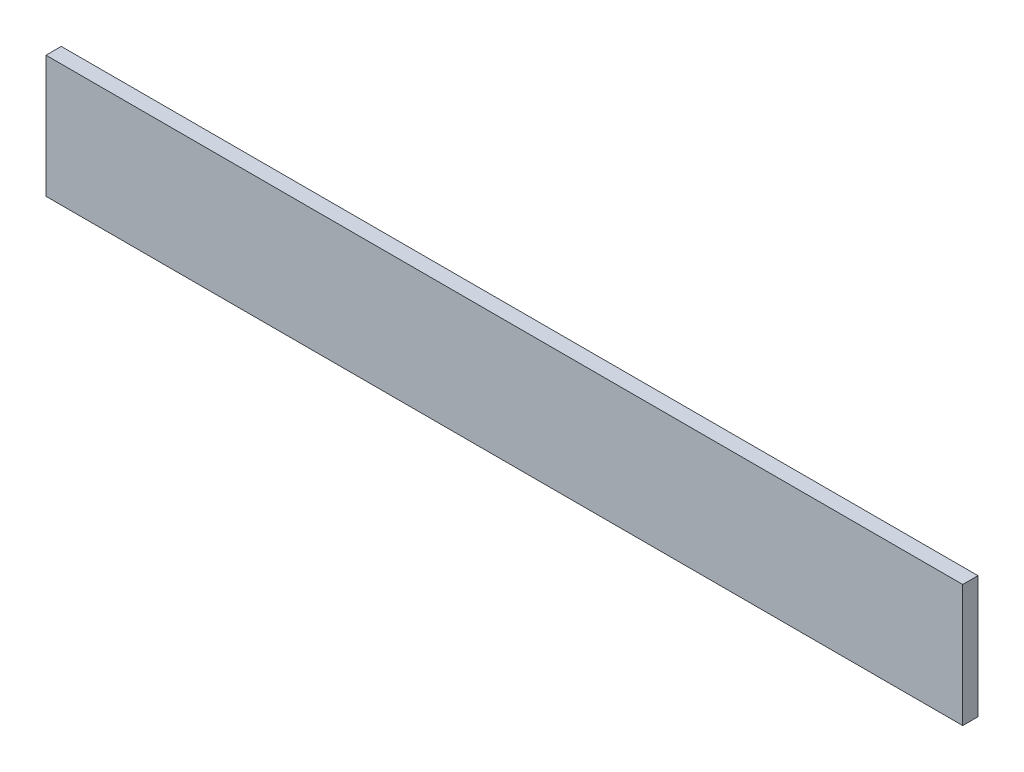
ISO-10303-21;
HEADER;
FILE_DESCRIPTION(('STEP AP214'),'2;1');
FILE_NAME('part.step','',(''),(''),'','','');
FILE_SCHEMA(('AUTOMOTIVE_DESIGN { 1 0 10303 214 1 1 1 1 }'));
ENDSEC;
DATA;
#1=APPLICATION_CONTEXT('core data for automotive mechanical design processes');
#2=APPLICATION_PROTOCOL_DEFINITION('international standard','automotive_design',2000,#1);
#3=PRODUCT_CONTEXT('',#1,'mechanical');
#4=PRODUCT('Part','Part','',(#3));
#5=PRODUCT_RELATED_PRODUCT_CATEGORY('part','',(#4));
#6=PRODUCT_DEFINITION_FORMATION('','',#4);
#7=PRODUCT_DEFINITION_CONTEXT('part definition',#1,'design');
#8=PRODUCT_DEFINITION('design','',#6,#7);
#9=PRODUCT_DEFINITION_SHAPE('','',#8);
#10=(LENGTH_UNIT() NAMED_UNIT(*) SI_UNIT(.MILLI.,.METRE.));
#11=(NAMED_UNIT(*) PLANE_ANGLE_UNIT() SI_UNIT($,.RADIAN.));
#12=(NAMED_UNIT(*) SI_UNIT($,.STERADIAN.) SOLID_ANGLE_UNIT());
#13=UNCERTAINTY_MEASURE_WITH_UNIT(LENGTH_MEASURE(1.E-05),#10,'distance_accuracy_value','');
#14=(GEOMETRIC_REPRESENTATION_CONTEXT(3) GLOBAL_UNCERTAINTY_ASSIGNED_CONTEXT((#13)) GLOBAL_UNIT_ASSIGNED_CONTEXT((#10,
#11,#12)) REPRESENTATION_CONTEXT('',''));
#15=CARTESIAN_POINT('',(0.,0.,0.));
#16=DIRECTION('',(0.,0.,1.));
#17=DIRECTION('',(1.,0.,0.));
#18=AXIS2_PLACEMENT_3D('',#15,#16,#17);
#19=CARTESIAN_POINT('',(60.,8.,2.));
#20=DIRECTION('',(-1.,0.,0.));
#21=DIRECTION('',(0.,0.,1.));
#22=AXIS2_PLACEMENT_3D('',#19,#20,#21);
#23=PLANE('',#22);
#24=DIRECTION('',(0.,1.,0.));
#25=VECTOR('',#24,1.);
#26=CARTESIAN_POINT('',(60.,8.,0.));
#27=LINE('',#26,#25);
#28=CARTESIAN_POINT('',(60.,-8.,0.));
#29=VERTEX_POINT('',#28);
#30=CARTESIAN_POINT('',(60.,8.,0.));
#31=VERTEX_POINT('',#30);
#32=EDGE_CURVE('E96',#29,#31,#27,.T.);
#33=ORIENTED_EDGE('',*,*,#32,.T.);
#34=DIRECTION('',(0.,0.,-1.));
#35=VECTOR('',#34,1.);
#36=CARTESIAN_POINT('',(60.,8.,2.));
#37=LINE('',#36,#35);
#38=CARTESIAN_POINT('',(60.,8.,2.));
#39=VERTEX_POINT('',#38);
#40=EDGE_CURVE('E11',#39,#31,#37,.T.);
#41=ORIENTED_EDGE('',*,*,#40,.F.);
#42=DIRECTION('',(0.,1.,0.));
#43=VECTOR('',#42,1.);
#44=CARTESIAN_POINT('',(60.,8.,2.));
#45=LINE('',#44,#43);
#46=CARTESIAN_POINT('',(60.,-8.,2.));
#47=VERTEX_POINT('',#46);
#48=EDGE_CURVE('E84',#47,#39,#45,.T.);
#49=ORIENTED_EDGE('',*,*,#48,.F.);
#50=DIRECTION('',(0.,0.,-1.));
#51=VECTOR('',#50,1.);
#52=CARTESIAN_POINT('',(60.,-8.,2.));
#53=LINE('',#52,#51);
#54=EDGE_CURVE('E92',#47,#29,#53,.T.);
#55=ORIENTED_EDGE('',*,*,#54,.T.);
#56=EDGE_LOOP('',(#33,#41,#49,#55));
#57=FACE_BOUND('',#56,.T.);
#58=ADVANCED_FACE('F33',(#57),#23,.F.);
#59=CARTESIAN_POINT('',(-60.,8.,2.));
#60=DIRECTION('',(0.,-1.,0.));
#61=DIRECTION('',(0.,0.,-1.));
#62=AXIS2_PLACEMENT_3D('',#59,#60,#61);
#63=PLANE('',#62);
#64=DIRECTION('',(-1.,0.,0.));
#65=VECTOR('',#64,1.);
#66=CARTESIAN_POINT('',(-60.,8.,0.));
#67=LINE('',#66,#65);
#68=CARTESIAN_POINT('',(-60.,8.,0.));
#69=VERTEX_POINT('',#68);
#70=EDGE_CURVE('E88',#31,#69,#67,.T.);
#71=ORIENTED_EDGE('',*,*,#70,.T.);
#72=DIRECTION('',(0.,0.,-1.));
#73=VECTOR('',#72,1.);
#74=CARTESIAN_POINT('',(-60.,8.,2.));
#75=LINE('',#74,#73);
#76=CARTESIAN_POINT('',(-60.,8.,2.));
#77=VERTEX_POINT('',#76);
#78=EDGE_CURVE('E41',#77,#69,#75,.T.);
#79=ORIENTED_EDGE('',*,*,#78,.F.);
#80=DIRECTION('',(-1.,0.,0.));
#81=VECTOR('',#80,1.);
#82=CARTESIAN_POINT('',(-60.,8.,2.));
#83=LINE('',#82,#81);
#84=EDGE_CURVE('E79',#39,#77,#83,.T.);
#85=ORIENTED_EDGE('',*,*,#84,.F.);
#86=ORIENTED_EDGE('',*,*,#40,.T.);
#87=EDGE_LOOP('',(#71,#79,#85,#86));
#88=FACE_BOUND('',#87,.T.);
#89=ADVANCED_FACE('F87',(#88),#63,.F.);
#90=CARTESIAN_POINT('',(-60.,8.,2.));
#91=DIRECTION('',(1.,0.,0.));
#92=DIRECTION('',(0.,0.,-1.));
#93=AXIS2_PLACEMENT_3D('',#90,#91,#92);
#94=PLANE('',#93);
#95=DIRECTION('',(0.,-1.,0.));
#96=VECTOR('',#95,1.);
#97=CARTESIAN_POINT('',(-60.,8.,0.));
#98=LINE('',#97,#96);
#99=CARTESIAN_POINT('',(-60.,-8.,0.));
#100=VERTEX_POINT('',#99);
#101=EDGE_CURVE('E66',#69,#100,#98,.T.);
#102=ORIENTED_EDGE('',*,*,#101,.T.);
#103=DIRECTION('',(0.,0.,-1.));
#104=VECTOR('',#103,1.);
#105=CARTESIAN_POINT('',(-60.,-8.,2.));
#106=LINE('',#105,#104);
#107=CARTESIAN_POINT('',(-60.,-8.,2.));
#108=VERTEX_POINT('',#107);
#109=EDGE_CURVE('E89',#108,#100,#106,.T.);
#110=ORIENTED_EDGE('',*,*,#109,.F.);
#111=DIRECTION('',(0.,-1.,0.));
#112=VECTOR('',#111,1.);
#113=CARTESIAN_POINT('',(-60.,8.,2.));
#114=LINE('',#113,#112);
#115=EDGE_CURVE('E82',#77,#108,#114,.T.);
#116=ORIENTED_EDGE('',*,*,#115,.F.);
#117=ORIENTED_EDGE('',*,*,#78,.T.);
#118=EDGE_LOOP('',(#102,#110,#116,#117));
#119=FACE_BOUND('',#118,.T.);
#120=ADVANCED_FACE('F90',(#119),#94,.F.);
#121=CARTESIAN_POINT('',(-60.,-8.,2.));
#122=DIRECTION('',(0.,1.,0.));
#123=DIRECTION('',(0.,0.,1.));
#124=AXIS2_PLACEMENT_3D('',#121,#122,#123);
#125=PLANE('',#124);
#126=DIRECTION('',(1.,0.,0.));
#127=VECTOR('',#126,1.);
#128=CARTESIAN_POINT('',(-60.,-8.,0.));
#129=LINE('',#128,#127);
#130=EDGE_CURVE('E72',#100,#29,#129,.T.);
#131=ORIENTED_EDGE('',*,*,#130,.T.);
#132=ORIENTED_EDGE('',*,*,#54,.F.);
#133=DIRECTION('',(1.,0.,0.));
#134=VECTOR('',#133,1.);
#135=CARTESIAN_POINT('',(-60.,-8.,2.));
#136=LINE('',#135,#134);
#137=EDGE_CURVE('E49',#108,#47,#136,.T.);
#138=ORIENTED_EDGE('',*,*,#137,.F.);
#139=ORIENTED_EDGE('',*,*,#109,.T.);
#140=EDGE_LOOP('',(#131,#132,#138,#139));
#141=FACE_BOUND('',#140,.T.);
#142=ADVANCED_FACE('F103',(#141),#125,.F.);
#143=CARTESIAN_POINT('',(0.,0.,2.));
#144=DIRECTION('',(0.,0.,1.));
#145=DIRECTION('',(1.,0.,0.));
#146=AXIS2_PLACEMENT_3D('',#143,#144,#145);
#147=PLANE('',#146);
#148=ORIENTED_EDGE('',*,*,#48,.T.);
#149=ORIENTED_EDGE('',*,*,#84,.T.);
#150=ORIENTED_EDGE('',*,*,#115,.T.);
#151=ORIENTED_EDGE('',*,*,#137,.T.);
#152=EDGE_LOOP('',(#148,#149,#150,#151));
#153=FACE_BOUND('',#152,.T.);
#154=ADVANCED_FACE('F80',(#153),#147,.T.);
#155=CARTESIAN_POINT('',(0.,0.,0.));
#156=DIRECTION('',(0.,0.,1.));
#157=DIRECTION('',(1.,0.,0.));
#158=AXIS2_PLACEMENT_3D('',#155,#156,#157);
#159=PLANE('',#158);
#160=ORIENTED_EDGE('',*,*,#32,.F.);
#161=ORIENTED_EDGE('',*,*,#130,.F.);
#162=ORIENTED_EDGE('',*,*,#101,.F.);
#163=ORIENTED_EDGE('',*,*,#70,.F.);
#164=EDGE_LOOP('',(#160,#161,#162,#163));
#165=FACE_BOUND('',#164,.T.);
#166=ADVANCED_FACE('F106',(#165),#159,.F.);
#167=CLOSED_SHELL('',(#58,#89,#120,#142,#154,#166));
#168=MANIFOLD_SOLID_BREP('B2',#167);
#169=ADVANCED_BREP_SHAPE_REPRESENTATION('',(#18,#168),#14);
#170=SHAPE_DEFINITION_REPRESENTATION(#9,#169);
ENDSEC;
END-ISO-10303-21;
